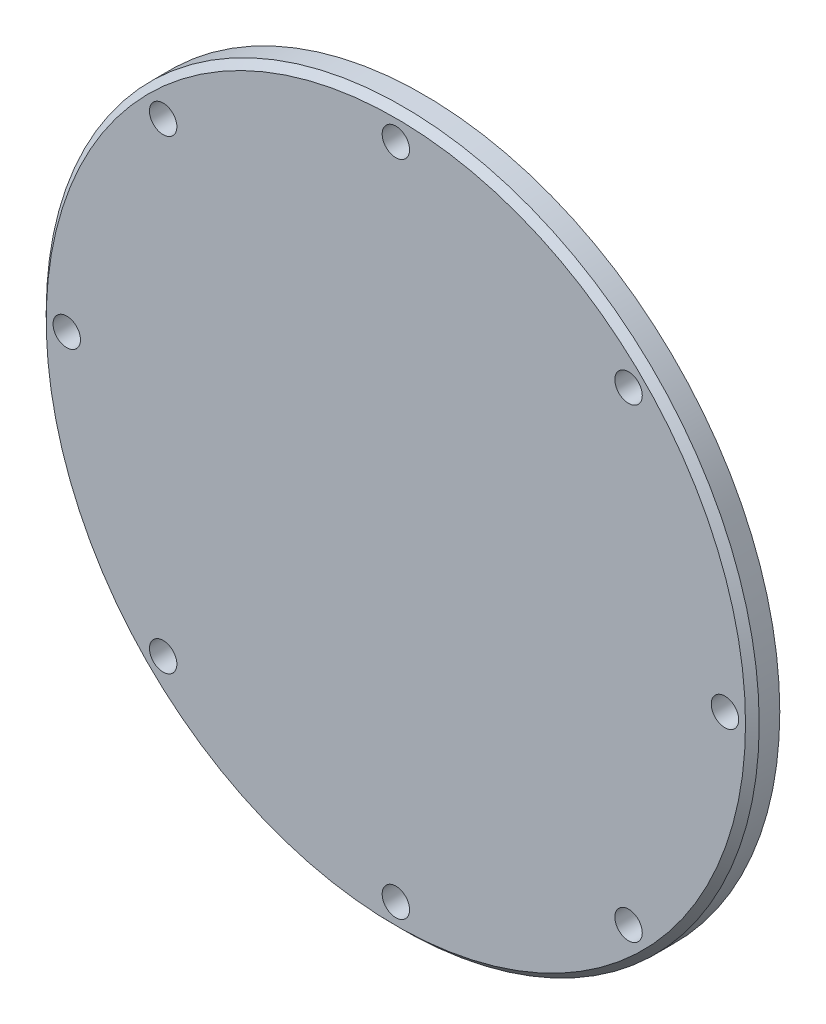
ISO-10303-21;
HEADER;
FILE_DESCRIPTION(('STEP AP214'),'2;1');
FILE_NAME('part.step','',(''),(''),'','','');
FILE_SCHEMA(('AUTOMOTIVE_DESIGN { 1 0 10303 214 1 1 1 1 }'));
ENDSEC;
DATA;
#1=APPLICATION_CONTEXT('core data for automotive mechanical design processes');
#2=APPLICATION_PROTOCOL_DEFINITION('international standard','automotive_design',2000,#1);
#3=PRODUCT_CONTEXT('',#1,'mechanical');
#4=PRODUCT('Part','Part','',(#3));
#5=PRODUCT_RELATED_PRODUCT_CATEGORY('part','',(#4));
#6=PRODUCT_DEFINITION_FORMATION('','',#4);
#7=PRODUCT_DEFINITION_CONTEXT('part definition',#1,'design');
#8=PRODUCT_DEFINITION('design','',#6,#7);
#9=PRODUCT_DEFINITION_SHAPE('','',#8);
#10=(LENGTH_UNIT() NAMED_UNIT(*) SI_UNIT(.MILLI.,.METRE.));
#11=(NAMED_UNIT(*) PLANE_ANGLE_UNIT() SI_UNIT($,.RADIAN.));
#12=(NAMED_UNIT(*) SI_UNIT($,.STERADIAN.) SOLID_ANGLE_UNIT());
#13=UNCERTAINTY_MEASURE_WITH_UNIT(LENGTH_MEASURE(1.E-05),#10,'distance_accuracy_value','');
#14=(GEOMETRIC_REPRESENTATION_CONTEXT(3) GLOBAL_UNCERTAINTY_ASSIGNED_CONTEXT((#13)) GLOBAL_UNIT_ASSIGNED_CONTEXT((#10,
#11,#12)) REPRESENTATION_CONTEXT('',''));
#15=CARTESIAN_POINT('',(0.,0.,0.));
#16=DIRECTION('',(0.,0.,1.));
#17=DIRECTION('',(1.,0.,0.));
#18=AXIS2_PLACEMENT_3D('',#15,#16,#17);
#19=CARTESIAN_POINT('',(0.,0.,2.));
#20=DIRECTION('',(0.,0.,-1.));
#21=DIRECTION('',(-1.,0.,0.));
#22=AXIS2_PLACEMENT_3D('',#19,#20,#21);
#23=CYLINDRICAL_SURFACE('',#22,26.);
#24=CARTESIAN_POINT('',(0.,0.,1.49999999999999));
#25=DIRECTION('',(0.,0.,1.));
#26=DIRECTION('',(1.,0.,0.));
#27=AXIS2_PLACEMENT_3D('',#24,#25,#26);
#28=CIRCLE('',#27,26.);
#29=CARTESIAN_POINT('',(26.,0.,1.49999999999999));
#30=VERTEX_POINT('',#29);
#31=EDGE_CURVE('E10',#30,#30,#28,.F.);
#32=ORIENTED_EDGE('',*,*,#31,.T.);
#33=EDGE_LOOP('',(#32));
#34=FACE_BOUND('',#33,.T.);
#35=CARTESIAN_POINT('',(0.,0.,0.));
#36=DIRECTION('',(0.,0.,1.));
#37=DIRECTION('',(1.,0.,0.));
#38=AXIS2_PLACEMENT_3D('',#35,#36,#37);
#39=CIRCLE('',#38,26.);
#40=CARTESIAN_POINT('',(26.,0.,0.));
#41=VERTEX_POINT('',#40);
#42=EDGE_CURVE('E44',#41,#41,#39,.T.);
#43=ORIENTED_EDGE('',*,*,#42,.T.);
#44=EDGE_LOOP('',(#43));
#45=FACE_BOUND('',#44,.T.);
#46=ADVANCED_FACE('F33',(#34,#45),#23,.T.);
#47=CARTESIAN_POINT('',(0.,0.,2.));
#48=DIRECTION('',(0.,0.,1.));
#49=DIRECTION('',(1.,0.,0.));
#50=AXIS2_PLACEMENT_3D('',#47,#48,#49);
#51=PLANE('',#50);
#52=CARTESIAN_POINT('',(0.,0.,2.));
#53=DIRECTION('',(0.,0.,1.));
#54=DIRECTION('',(1.,0.,0.));
#55=AXIS2_PLACEMENT_3D('',#52,#53,#54);
#56=CIRCLE('',#55,25.5);
#57=CARTESIAN_POINT('',(25.5,0.,2.));
#58=VERTEX_POINT('',#57);
#59=EDGE_CURVE('E40',#58,#58,#56,.T.);
#60=ORIENTED_EDGE('',*,*,#59,.T.);
#61=EDGE_LOOP('',(#60));
#62=FACE_BOUND('',#61,.T.);
#63=CARTESIAN_POINT('',(0.,24.,2.));
#64=DIRECTION('',(0.,0.,1.));
#65=DIRECTION('',(1.,0.,0.));
#66=AXIS2_PLACEMENT_3D('',#63,#64,#65);
#67=CIRCLE('',#66,1.);
#68=CARTESIAN_POINT('',(1.,24.,2.));
#69=VERTEX_POINT('',#68);
#70=EDGE_CURVE('E93',#69,#69,#67,.T.);
#71=ORIENTED_EDGE('',*,*,#70,.F.);
#72=EDGE_LOOP('',(#71));
#73=FACE_BOUND('',#72,.T.);
#74=CARTESIAN_POINT('',(16.9705627484774,16.9705627484779,2.));
#75=DIRECTION('',(0.,0.,1.));
#76=DIRECTION('',(1.,0.,0.));
#77=AXIS2_PLACEMENT_3D('',#74,#75,#76);
#78=CIRCLE('',#77,1.00000000000012);
#79=CARTESIAN_POINT('',(17.9705627484776,16.9705627484779,2.));
#80=VERTEX_POINT('',#79);
#81=EDGE_CURVE('E87',#80,#80,#78,.T.);
#82=ORIENTED_EDGE('',*,*,#81,.F.);
#83=EDGE_LOOP('',(#82));
#84=FACE_BOUND('',#83,.T.);
#85=CARTESIAN_POINT('',(24.000000000001,1.02024238717659E-12,2.));
#86=DIRECTION('',(0.,0.,1.));
#87=DIRECTION('',(1.,0.,0.));
#88=AXIS2_PLACEMENT_3D('',#85,#86,#87);
#89=CIRCLE('',#88,1.00000000000076);
#90=CARTESIAN_POINT('',(25.0000000000018,1.02024238717659E-12,2.));
#91=VERTEX_POINT('',#90);
#92=EDGE_CURVE('E81',#91,#91,#89,.T.);
#93=ORIENTED_EDGE('',*,*,#92,.F.);
#94=EDGE_LOOP('',(#93));
#95=FACE_BOUND('',#94,.T.);
#96=CARTESIAN_POINT('',(16.9705627484789,-16.9705627484764,2.));
#97=DIRECTION('',(0.,0.,1.));
#98=DIRECTION('',(1.,0.,0.));
#99=AXIS2_PLACEMENT_3D('',#96,#97,#98);
#100=CIRCLE('',#99,1.00000000000158);
#101=CARTESIAN_POINT('',(17.9705627484805,-16.9705627484764,2.));
#102=VERTEX_POINT('',#101);
#103=EDGE_CURVE('E75',#102,#102,#100,.T.);
#104=ORIENTED_EDGE('',*,*,#103,.F.);
#105=EDGE_LOOP('',(#104));
#106=FACE_BOUND('',#105,.T.);
#107=CARTESIAN_POINT('',(2.04048477435318E-12,-24.,2.));
#108=DIRECTION('',(0.,0.,1.));
#109=DIRECTION('',(1.,0.,0.));
#110=AXIS2_PLACEMENT_3D('',#107,#108,#109);
#111=CIRCLE('',#110,1.00000000000211);
#112=CARTESIAN_POINT('',(1.00000000000415,-24.,2.));
#113=VERTEX_POINT('',#112);
#114=EDGE_CURVE('E69',#113,#113,#111,.T.);
#115=ORIENTED_EDGE('',*,*,#114,.F.);
#116=EDGE_LOOP('',(#115));
#117=FACE_BOUND('',#116,.T.);
#118=CARTESIAN_POINT('',(-16.9705627484754,-16.9705627484779,2.));
#119=DIRECTION('',(0.,0.,1.));
#120=DIRECTION('',(1.,0.,0.));
#121=AXIS2_PLACEMENT_3D('',#118,#119,#120);
#122=CIRCLE('',#121,1.00000000000207);
#123=CARTESIAN_POINT('',(-15.9705627484733,-16.9705627484779,2.));
#124=VERTEX_POINT('',#123);
#125=EDGE_CURVE('E63',#124,#124,#122,.T.);
#126=ORIENTED_EDGE('',*,*,#125,.F.);
#127=EDGE_LOOP('',(#126));
#128=FACE_BOUND('',#127,.T.);
#129=CARTESIAN_POINT('',(-23.999999999999,-1.02318153949454E-12,2.));
#130=DIRECTION('',(0.,0.,1.));
#131=DIRECTION('',(1.,0.,0.));
#132=AXIS2_PLACEMENT_3D('',#129,#130,#131);
#133=CIRCLE('',#132,1.00000000000152);
#134=CARTESIAN_POINT('',(-22.9999999999975,-1.02318153949454E-12,2.));
#135=VERTEX_POINT('',#134);
#136=EDGE_CURVE('E57',#135,#135,#133,.T.);
#137=ORIENTED_EDGE('',*,*,#136,.F.);
#138=EDGE_LOOP('',(#137));
#139=FACE_BOUND('',#138,.T.);
#140=CARTESIAN_POINT('',(-16.9705627484768,16.9705627484764,2.));
#141=DIRECTION('',(0.,0.,1.));
#142=DIRECTION('',(1.,0.,0.));
#143=AXIS2_PLACEMENT_3D('',#140,#141,#142);
#144=CIRCLE('',#143,1.00000000000078);
#145=CARTESIAN_POINT('',(-15.9705627484761,16.9705627484764,2.));
#146=VERTEX_POINT('',#145);
#147=EDGE_CURVE('E51',#146,#146,#144,.T.);
#148=ORIENTED_EDGE('',*,*,#147,.F.);
#149=EDGE_LOOP('',(#148));
#150=FACE_BOUND('',#149,.T.);
#151=ADVANCED_FACE('F109',(#62,#73,#84,#95,#106,#117,#128,#139,#150),#51,.T.);
#152=CARTESIAN_POINT('',(0.,0.,0.));
#153=DIRECTION('',(0.,0.,1.));
#154=DIRECTION('',(1.,0.,0.));
#155=AXIS2_PLACEMENT_3D('',#152,#153,#154);
#156=PLANE('',#155);
#157=CARTESIAN_POINT('',(0.,24.,0.));
#158=DIRECTION('',(0.,0.,1.));
#159=DIRECTION('',(1.,0.,0.));
#160=AXIS2_PLACEMENT_3D('',#157,#158,#159);
#161=CIRCLE('',#160,1.);
#162=CARTESIAN_POINT('',(1.,24.,0.));
#163=VERTEX_POINT('',#162);
#164=EDGE_CURVE('E48',#163,#163,#161,.T.);
#165=ORIENTED_EDGE('',*,*,#164,.T.);
#166=EDGE_LOOP('',(#165));
#167=FACE_BOUND('',#166,.T.);
#168=CARTESIAN_POINT('',(16.9705627484774,16.9705627484779,0.));
#169=DIRECTION('',(0.,0.,1.));
#170=DIRECTION('',(1.,0.,0.));
#171=AXIS2_PLACEMENT_3D('',#168,#169,#170);
#172=CIRCLE('',#171,1.00000000000012);
#173=CARTESIAN_POINT('',(17.9705627484776,16.9705627484779,0.));
#174=VERTEX_POINT('',#173);
#175=EDGE_CURVE('E90',#174,#174,#172,.T.);
#176=ORIENTED_EDGE('',*,*,#175,.T.);
#177=EDGE_LOOP('',(#176));
#178=FACE_BOUND('',#177,.T.);
#179=CARTESIAN_POINT('',(24.000000000001,1.02024238717659E-12,0.));
#180=DIRECTION('',(0.,0.,1.));
#181=DIRECTION('',(1.,0.,0.));
#182=AXIS2_PLACEMENT_3D('',#179,#180,#181);
#183=CIRCLE('',#182,1.00000000000076);
#184=CARTESIAN_POINT('',(25.0000000000018,1.02024238717659E-12,0.));
#185=VERTEX_POINT('',#184);
#186=EDGE_CURVE('E84',#185,#185,#183,.T.);
#187=ORIENTED_EDGE('',*,*,#186,.T.);
#188=EDGE_LOOP('',(#187));
#189=FACE_BOUND('',#188,.T.);
#190=CARTESIAN_POINT('',(16.9705627484789,-16.9705627484764,0.));
#191=DIRECTION('',(0.,0.,1.));
#192=DIRECTION('',(1.,0.,0.));
#193=AXIS2_PLACEMENT_3D('',#190,#191,#192);
#194=CIRCLE('',#193,1.00000000000158);
#195=CARTESIAN_POINT('',(17.9705627484805,-16.9705627484764,0.));
#196=VERTEX_POINT('',#195);
#197=EDGE_CURVE('E78',#196,#196,#194,.T.);
#198=ORIENTED_EDGE('',*,*,#197,.T.);
#199=EDGE_LOOP('',(#198));
#200=FACE_BOUND('',#199,.T.);
#201=CARTESIAN_POINT('',(2.04048477435318E-12,-24.,0.));
#202=DIRECTION('',(0.,0.,1.));
#203=DIRECTION('',(1.,0.,0.));
#204=AXIS2_PLACEMENT_3D('',#201,#202,#203);
#205=CIRCLE('',#204,1.00000000000211);
#206=CARTESIAN_POINT('',(1.00000000000415,-24.,0.));
#207=VERTEX_POINT('',#206);
#208=EDGE_CURVE('E72',#207,#207,#205,.T.);
#209=ORIENTED_EDGE('',*,*,#208,.T.);
#210=EDGE_LOOP('',(#209));
#211=FACE_BOUND('',#210,.T.);
#212=CARTESIAN_POINT('',(-16.9705627484754,-16.9705627484779,0.));
#213=DIRECTION('',(0.,0.,1.));
#214=DIRECTION('',(1.,0.,0.));
#215=AXIS2_PLACEMENT_3D('',#212,#213,#214);
#216=CIRCLE('',#215,1.00000000000207);
#217=CARTESIAN_POINT('',(-15.9705627484733,-16.9705627484779,0.));
#218=VERTEX_POINT('',#217);
#219=EDGE_CURVE('E66',#218,#218,#216,.T.);
#220=ORIENTED_EDGE('',*,*,#219,.T.);
#221=EDGE_LOOP('',(#220));
#222=FACE_BOUND('',#221,.T.);
#223=CARTESIAN_POINT('',(-23.999999999999,-1.02318153949454E-12,0.));
#224=DIRECTION('',(0.,0.,1.));
#225=DIRECTION('',(1.,0.,0.));
#226=AXIS2_PLACEMENT_3D('',#223,#224,#225);
#227=CIRCLE('',#226,1.00000000000152);
#228=CARTESIAN_POINT('',(-22.9999999999975,-1.02318153949454E-12,0.));
#229=VERTEX_POINT('',#228);
#230=EDGE_CURVE('E60',#229,#229,#227,.T.);
#231=ORIENTED_EDGE('',*,*,#230,.T.);
#232=EDGE_LOOP('',(#231));
#233=FACE_BOUND('',#232,.T.);
#234=CARTESIAN_POINT('',(-16.9705627484768,16.9705627484764,0.));
#235=DIRECTION('',(0.,0.,1.));
#236=DIRECTION('',(1.,0.,0.));
#237=AXIS2_PLACEMENT_3D('',#234,#235,#236);
#238=CIRCLE('',#237,1.00000000000078);
#239=CARTESIAN_POINT('',(-15.9705627484761,16.9705627484764,0.));
#240=VERTEX_POINT('',#239);
#241=EDGE_CURVE('E54',#240,#240,#238,.T.);
#242=ORIENTED_EDGE('',*,*,#241,.T.);
#243=EDGE_LOOP('',(#242));
#244=FACE_BOUND('',#243,.T.);
#245=ORIENTED_EDGE('',*,*,#42,.F.);
#246=EDGE_LOOP('',(#245));
#247=FACE_BOUND('',#246,.T.);
#248=ADVANCED_FACE('F99',(#167,#178,#189,#200,#211,#222,#233,#244,#247),#156,.F.);
#249=CARTESIAN_POINT('',(-16.9705627484768,16.9705627484764,0.));
#250=DIRECTION('',(0.,0.,1.));
#251=DIRECTION('',(1.,0.,0.));
#252=AXIS2_PLACEMENT_3D('',#249,#250,#251);
#253=CYLINDRICAL_SURFACE('',#252,1.00000000000078);
#254=ORIENTED_EDGE('',*,*,#241,.F.);
#255=EDGE_LOOP('',(#254));
#256=FACE_BOUND('',#255,.T.);
#257=ORIENTED_EDGE('',*,*,#147,.T.);
#258=EDGE_LOOP('',(#257));
#259=FACE_BOUND('',#258,.T.);
#260=ADVANCED_FACE('F127',(#256,#259),#253,.F.);
#261=CARTESIAN_POINT('',(-23.999999999999,-1.02318153949454E-12,0.));
#262=DIRECTION('',(0.,0.,1.));
#263=DIRECTION('',(1.,0.,0.));
#264=AXIS2_PLACEMENT_3D('',#261,#262,#263);
#265=CYLINDRICAL_SURFACE('',#264,1.00000000000152);
#266=ORIENTED_EDGE('',*,*,#230,.F.);
#267=EDGE_LOOP('',(#266));
#268=FACE_BOUND('',#267,.T.);
#269=ORIENTED_EDGE('',*,*,#136,.T.);
#270=EDGE_LOOP('',(#269));
#271=FACE_BOUND('',#270,.T.);
#272=ADVANCED_FACE('F129',(#268,#271),#265,.F.);
#273=CARTESIAN_POINT('',(-16.9705627484754,-16.9705627484779,0.));
#274=DIRECTION('',(0.,0.,1.));
#275=DIRECTION('',(1.,0.,0.));
#276=AXIS2_PLACEMENT_3D('',#273,#274,#275);
#277=CYLINDRICAL_SURFACE('',#276,1.00000000000207);
#278=ORIENTED_EDGE('',*,*,#219,.F.);
#279=EDGE_LOOP('',(#278));
#280=FACE_BOUND('',#279,.T.);
#281=ORIENTED_EDGE('',*,*,#125,.T.);
#282=EDGE_LOOP('',(#281));
#283=FACE_BOUND('',#282,.T.);
#284=ADVANCED_FACE('F136',(#280,#283),#277,.F.);
#285=CARTESIAN_POINT('',(2.04048477435318E-12,-24.,0.));
#286=DIRECTION('',(0.,0.,1.));
#287=DIRECTION('',(1.,0.,0.));
#288=AXIS2_PLACEMENT_3D('',#285,#286,#287);
#289=CYLINDRICAL_SURFACE('',#288,1.00000000000211);
#290=ORIENTED_EDGE('',*,*,#208,.F.);
#291=EDGE_LOOP('',(#290));
#292=FACE_BOUND('',#291,.T.);
#293=ORIENTED_EDGE('',*,*,#114,.T.);
#294=EDGE_LOOP('',(#293));
#295=FACE_BOUND('',#294,.T.);
#296=ADVANCED_FACE('F176',(#292,#295),#289,.F.);
#297=CARTESIAN_POINT('',(16.9705627484789,-16.9705627484764,0.));
#298=DIRECTION('',(0.,0.,1.));
#299=DIRECTION('',(1.,0.,0.));
#300=AXIS2_PLACEMENT_3D('',#297,#298,#299);
#301=CYLINDRICAL_SURFACE('',#300,1.00000000000158);
#302=ORIENTED_EDGE('',*,*,#197,.F.);
#303=EDGE_LOOP('',(#302));
#304=FACE_BOUND('',#303,.T.);
#305=ORIENTED_EDGE('',*,*,#103,.T.);
#306=EDGE_LOOP('',(#305));
#307=FACE_BOUND('',#306,.T.);
#308=ADVANCED_FACE('F186',(#304,#307),#301,.F.);
#309=CARTESIAN_POINT('',(24.000000000001,1.02024238717659E-12,0.));
#310=DIRECTION('',(0.,0.,1.));
#311=DIRECTION('',(1.,0.,0.));
#312=AXIS2_PLACEMENT_3D('',#309,#310,#311);
#313=CYLINDRICAL_SURFACE('',#312,1.00000000000076);
#314=ORIENTED_EDGE('',*,*,#186,.F.);
#315=EDGE_LOOP('',(#314));
#316=FACE_BOUND('',#315,.T.);
#317=ORIENTED_EDGE('',*,*,#92,.T.);
#318=EDGE_LOOP('',(#317));
#319=FACE_BOUND('',#318,.T.);
#320=ADVANCED_FACE('F196',(#316,#319),#313,.F.);
#321=CARTESIAN_POINT('',(16.9705627484774,16.9705627484779,0.));
#322=DIRECTION('',(0.,0.,1.));
#323=DIRECTION('',(1.,0.,0.));
#324=AXIS2_PLACEMENT_3D('',#321,#322,#323);
#325=CYLINDRICAL_SURFACE('',#324,1.00000000000012);
#326=ORIENTED_EDGE('',*,*,#175,.F.);
#327=EDGE_LOOP('',(#326));
#328=FACE_BOUND('',#327,.T.);
#329=ORIENTED_EDGE('',*,*,#81,.T.);
#330=EDGE_LOOP('',(#329));
#331=FACE_BOUND('',#330,.T.);
#332=ADVANCED_FACE('F105',(#328,#331),#325,.F.);
#333=CARTESIAN_POINT('',(0.,24.,0.));
#334=DIRECTION('',(0.,0.,1.));
#335=DIRECTION('',(1.,0.,0.));
#336=AXIS2_PLACEMENT_3D('',#333,#334,#335);
#337=CYLINDRICAL_SURFACE('',#336,1.);
#338=ORIENTED_EDGE('',*,*,#164,.F.);
#339=EDGE_LOOP('',(#338));
#340=FACE_BOUND('',#339,.T.);
#341=ORIENTED_EDGE('',*,*,#70,.T.);
#342=EDGE_LOOP('',(#341));
#343=FACE_BOUND('',#342,.T.);
#344=ADVANCED_FACE('F102',(#340,#343),#337,.F.);
#345=CARTESIAN_POINT('',(0.,0.,2.));
#346=DIRECTION('',(0.,0.,-1.));
#347=DIRECTION('',(-1.,0.,0.));
#348=AXIS2_PLACEMENT_3D('',#345,#346,#347);
#349=CONICAL_SURFACE('',#348,25.5,0.785398163397445);
#350=ORIENTED_EDGE('',*,*,#31,.F.);
#351=EDGE_LOOP('',(#350));
#352=FACE_BOUND('',#351,.T.);
#353=ORIENTED_EDGE('',*,*,#59,.F.);
#354=EDGE_LOOP('',(#353));
#355=FACE_BOUND('',#354,.T.);
#356=ADVANCED_FACE('F35',(#352,#355),#349,.T.);
#357=CLOSED_SHELL('',(#46,#151,#248,#260,#272,#284,#296,#308,#320,#332,#344,#356));
#358=MANIFOLD_SOLID_BREP('B2',#357);
#359=ADVANCED_BREP_SHAPE_REPRESENTATION('',(#18,#358),#14);
#360=SHAPE_DEFINITION_REPRESENTATION(#9,#359);
ENDSEC;
END-ISO-10303-21;
